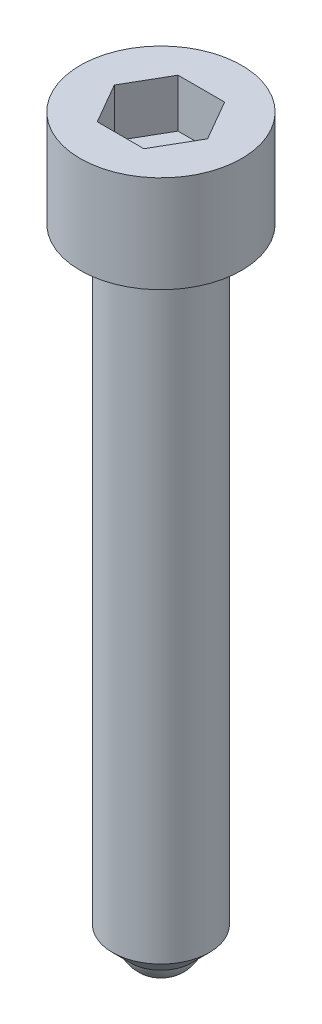
ISO-10303-21;
HEADER;
FILE_DESCRIPTION(('STEP AP214'),'2;1');
FILE_NAME('part.step','',(''),(''),'','','');
FILE_SCHEMA(('AUTOMOTIVE_DESIGN { 1 0 10303 214 1 1 1 1 }'));
ENDSEC;
DATA;
#1=APPLICATION_CONTEXT('core data for automotive mechanical design processes');
#2=APPLICATION_PROTOCOL_DEFINITION('international standard','automotive_design',2000,#1);
#3=PRODUCT_CONTEXT('',#1,'mechanical');
#4=PRODUCT('Part','Part','',(#3));
#5=PRODUCT_RELATED_PRODUCT_CATEGORY('part','',(#4));
#6=PRODUCT_DEFINITION_FORMATION('','',#4);
#7=PRODUCT_DEFINITION_CONTEXT('part definition',#1,'design');
#8=PRODUCT_DEFINITION('design','',#6,#7);
#9=PRODUCT_DEFINITION_SHAPE('','',#8);
#10=(LENGTH_UNIT() NAMED_UNIT(*) SI_UNIT(.MILLI.,.METRE.));
#11=(NAMED_UNIT(*) PLANE_ANGLE_UNIT() SI_UNIT($,.RADIAN.));
#12=(NAMED_UNIT(*) SI_UNIT($,.STERADIAN.) SOLID_ANGLE_UNIT());
#13=UNCERTAINTY_MEASURE_WITH_UNIT(LENGTH_MEASURE(1.E-05),#10,'distance_accuracy_value','');
#14=(GEOMETRIC_REPRESENTATION_CONTEXT(3) GLOBAL_UNCERTAINTY_ASSIGNED_CONTEXT((#13)) GLOBAL_UNIT_ASSIGNED_CONTEXT((#10,
#11,#12)) REPRESENTATION_CONTEXT('',''));
#15=CARTESIAN_POINT('',(0.,0.,0.));
#16=DIRECTION('',(0.,0.,1.));
#17=DIRECTION('',(1.,0.,0.));
#18=AXIS2_PLACEMENT_3D('',#15,#16,#17);
#19=CARTESIAN_POINT('',(0.,-38.,0.));
#20=DIRECTION('',(0.,1.,0.));
#21=DIRECTION('',(1.,0.,0.));
#22=AXIS2_PLACEMENT_3D('',#19,#20,#21);
#23=SPHERICAL_SURFACE('',#22,2.);
#24=CARTESIAN_POINT('',(0.,-38.7,0.));
#25=DIRECTION('',(0.,1.,0.));
#26=DIRECTION('',(0.,0.,1.));
#27=AXIS2_PLACEMENT_3D('',#24,#25,#26);
#28=CIRCLE('',#27,1.87349939951953);
#29=CARTESIAN_POINT('',(0.,-38.7,1.87349939951953));
#30=VERTEX_POINT('',#29);
#31=EDGE_CURVE('E11',#30,#30,#28,.T.);
#32=ORIENTED_EDGE('',*,*,#31,.F.);
#33=EDGE_LOOP('',(#32));
#34=FACE_BOUND('',#33,.T.);
#35=ADVANCED_FACE('F34',(#34),#23,.T.);
#36=CARTESIAN_POINT('',(0.,-38.7,0.));
#37=DIRECTION('',(0.,1.,0.));
#38=DIRECTION('',(0.,0.,1.));
#39=AXIS2_PLACEMENT_3D('',#36,#37,#38);
#40=CONICAL_SURFACE('',#39,1.87349939951953,0.785398163397446);
#41=CARTESIAN_POINT('',(0.,-37.5734993995195,0.));
#42=DIRECTION('',(0.,1.,0.));
#43=DIRECTION('',(0.,0.,1.));
#44=AXIS2_PLACEMENT_3D('',#41,#42,#43);
#45=CIRCLE('',#44,3.00000000000001);
#46=CARTESIAN_POINT('',(0.,-37.5734993995195,3.00000000000001));
#47=VERTEX_POINT('',#46);
#48=EDGE_CURVE('E41',#47,#47,#45,.T.);
#49=ORIENTED_EDGE('',*,*,#48,.F.);
#50=EDGE_LOOP('',(#49));
#51=FACE_BOUND('',#50,.T.);
#52=ORIENTED_EDGE('',*,*,#31,.T.);
#53=EDGE_LOOP('',(#52));
#54=FACE_BOUND('',#53,.T.);
#55=ADVANCED_FACE('F153',(#51,#54),#40,.T.);
#56=CARTESIAN_POINT('',(0.,61.6916426261037,0.));
#57=DIRECTION('',(0.,1.,0.));
#58=DIRECTION('',(0.,0.,1.));
#59=AXIS2_PLACEMENT_3D('',#56,#57,#58);
#60=CYLINDRICAL_SURFACE('',#59,3.00000000000001);
#61=CARTESIAN_POINT('',(0.,0.,0.));
#62=DIRECTION('',(0.,1.,0.));
#63=DIRECTION('',(0.,0.,1.));
#64=AXIS2_PLACEMENT_3D('',#61,#62,#63);
#65=CIRCLE('',#64,3.00000000000001);
#66=CARTESIAN_POINT('',(0.,0.,3.00000000000001));
#67=VERTEX_POINT('',#66);
#68=EDGE_CURVE('E146',#67,#67,#65,.T.);
#69=ORIENTED_EDGE('',*,*,#68,.F.);
#70=EDGE_LOOP('',(#69));
#71=FACE_BOUND('',#70,.T.);
#72=ORIENTED_EDGE('',*,*,#48,.T.);
#73=EDGE_LOOP('',(#72));
#74=FACE_BOUND('',#73,.T.);
#75=ADVANCED_FACE('F151',(#71,#74),#60,.T.);
#76=CARTESIAN_POINT('',(3.00000000000001,0.,0.));
#77=DIRECTION('',(0.,1.,0.));
#78=DIRECTION('',(0.,0.,1.));
#79=AXIS2_PLACEMENT_3D('',#76,#77,#78);
#80=PLANE('',#79);
#81=CARTESIAN_POINT('',(0.,0.,0.));
#82=DIRECTION('',(0.,1.,0.));
#83=DIRECTION('',(0.,0.,1.));
#84=AXIS2_PLACEMENT_3D('',#81,#82,#83);
#85=CIRCLE('',#84,5.00000000000001);
#86=CARTESIAN_POINT('',(0.,0.,5.00000000000001));
#87=VERTEX_POINT('',#86);
#88=EDGE_CURVE('E143',#87,#87,#85,.T.);
#89=ORIENTED_EDGE('',*,*,#88,.F.);
#90=EDGE_LOOP('',(#89));
#91=FACE_BOUND('',#90,.T.);
#92=ORIENTED_EDGE('',*,*,#68,.T.);
#93=EDGE_LOOP('',(#92));
#94=FACE_BOUND('',#93,.T.);
#95=ADVANCED_FACE('F171',(#91,#94),#80,.F.);
#96=CARTESIAN_POINT('',(0.,61.6916426261037,0.));
#97=DIRECTION('',(0.,1.,0.));
#98=DIRECTION('',(0.,0.,1.));
#99=AXIS2_PLACEMENT_3D('',#96,#97,#98);
#100=CYLINDRICAL_SURFACE('',#99,5.00000000000001);
#101=CARTESIAN_POINT('',(0.,6.,0.));
#102=DIRECTION('',(0.,1.,0.));
#103=DIRECTION('',(0.,0.,1.));
#104=AXIS2_PLACEMENT_3D('',#101,#102,#103);
#105=CIRCLE('',#104,5.00000000000001);
#106=CARTESIAN_POINT('',(0.,6.,5.00000000000001));
#107=VERTEX_POINT('',#106);
#108=EDGE_CURVE('E135',#107,#107,#105,.T.);
#109=ORIENTED_EDGE('',*,*,#108,.F.);
#110=EDGE_LOOP('',(#109));
#111=FACE_BOUND('',#110,.T.);
#112=ORIENTED_EDGE('',*,*,#88,.T.);
#113=EDGE_LOOP('',(#112));
#114=FACE_BOUND('',#113,.T.);
#115=ADVANCED_FACE('F179',(#111,#114),#100,.T.);
#116=CARTESIAN_POINT('',(5.00000000000001,6.,0.));
#117=DIRECTION('',(0.,-1.,0.));
#118=DIRECTION('',(0.,0.,-1.));
#119=AXIS2_PLACEMENT_3D('',#116,#117,#118);
#120=PLANE('',#119);
#121=DIRECTION('',(-1.,0.,0.));
#122=VECTOR('',#121,1.);
#123=CARTESIAN_POINT('',(1.44337567297406,6.,-2.5));
#124=LINE('',#123,#122);
#125=CARTESIAN_POINT('',(1.44337567297406,6.,-2.5));
#126=VERTEX_POINT('',#125);
#127=CARTESIAN_POINT('',(-1.44337567297406,6.,-2.5));
#128=VERTEX_POINT('',#127);
#129=EDGE_CURVE('E122',#126,#128,#124,.T.);
#130=ORIENTED_EDGE('',*,*,#129,.F.);
#131=DIRECTION('',(-0.5,0.,-0.866025403784439));
#132=VECTOR('',#131,1.);
#133=CARTESIAN_POINT('',(2.88675134594813,6.,0.));
#134=LINE('',#133,#132);
#135=CARTESIAN_POINT('',(2.88675134594813,6.,0.));
#136=VERTEX_POINT('',#135);
#137=EDGE_CURVE('E48',#136,#126,#134,.T.);
#138=ORIENTED_EDGE('',*,*,#137,.F.);
#139=DIRECTION('',(0.5,0.,-0.866025403784439));
#140=VECTOR('',#139,1.);
#141=CARTESIAN_POINT('',(1.44337567297407,6.,2.5));
#142=LINE('',#141,#140);
#143=CARTESIAN_POINT('',(1.44337567297407,6.,2.5));
#144=VERTEX_POINT('',#143);
#145=EDGE_CURVE('E131',#144,#136,#142,.T.);
#146=ORIENTED_EDGE('',*,*,#145,.F.);
#147=DIRECTION('',(1.,0.,0.));
#148=VECTOR('',#147,1.);
#149=CARTESIAN_POINT('',(-1.44337567297406,6.,2.5));
#150=LINE('',#149,#148);
#151=CARTESIAN_POINT('',(-1.44337567297406,6.,2.5));
#152=VERTEX_POINT('',#151);
#153=EDGE_CURVE('E129',#152,#144,#150,.T.);
#154=ORIENTED_EDGE('',*,*,#153,.F.);
#155=DIRECTION('',(0.5,0.,0.866025403784439));
#156=VECTOR('',#155,1.);
#157=CARTESIAN_POINT('',(-2.88675134594813,6.,0.));
#158=LINE('',#157,#156);
#159=CARTESIAN_POINT('',(-2.88675134594813,6.,0.));
#160=VERTEX_POINT('',#159);
#161=EDGE_CURVE('E96',#160,#152,#158,.T.);
#162=ORIENTED_EDGE('',*,*,#161,.F.);
#163=DIRECTION('',(-0.5,0.,0.866025403784439));
#164=VECTOR('',#163,1.);
#165=CARTESIAN_POINT('',(-1.44337567297406,6.,-2.5));
#166=LINE('',#165,#164);
#167=EDGE_CURVE('E125',#128,#160,#166,.T.);
#168=ORIENTED_EDGE('',*,*,#167,.F.);
#169=EDGE_LOOP('',(#130,#138,#146,#154,#162,#168));
#170=FACE_BOUND('',#169,.T.);
#171=ORIENTED_EDGE('',*,*,#108,.T.);
#172=EDGE_LOOP('',(#171));
#173=FACE_BOUND('',#172,.T.);
#174=ADVANCED_FACE('F187',(#170,#173),#120,.F.);
#175=CARTESIAN_POINT('',(2.88675134594813,3.,0.));
#176=DIRECTION('',(0.866025403784438,0.,-0.5));
#177=DIRECTION('',(-0.5,0.,-0.866025403784439));
#178=AXIS2_PLACEMENT_3D('',#175,#176,#177);
#179=PLANE('',#178);
#180=ORIENTED_EDGE('',*,*,#137,.T.);
#181=DIRECTION('',(0.,1.,0.));
#182=VECTOR('',#181,1.);
#183=CARTESIAN_POINT('',(1.44337567297406,3.,-2.5));
#184=LINE('',#183,#182);
#185=CARTESIAN_POINT('',(1.44337567297406,3.,-2.5));
#186=VERTEX_POINT('',#185);
#187=EDGE_CURVE('E78',#186,#126,#184,.T.);
#188=ORIENTED_EDGE('',*,*,#187,.F.);
#189=DIRECTION('',(-0.5,0.,-0.866025403784439));
#190=VECTOR('',#189,1.);
#191=CARTESIAN_POINT('',(2.88675134594813,3.,0.));
#192=LINE('',#191,#190);
#193=CARTESIAN_POINT('',(2.88675134594813,3.,0.));
#194=VERTEX_POINT('',#193);
#195=EDGE_CURVE('E133',#194,#186,#192,.T.);
#196=ORIENTED_EDGE('',*,*,#195,.F.);
#197=DIRECTION('',(0.,1.,0.));
#198=VECTOR('',#197,1.);
#199=CARTESIAN_POINT('',(2.88675134594813,3.,0.));
#200=LINE('',#199,#198);
#201=EDGE_CURVE('E56',#194,#136,#200,.T.);
#202=ORIENTED_EDGE('',*,*,#201,.T.);
#203=EDGE_LOOP('',(#180,#188,#196,#202));
#204=FACE_BOUND('',#203,.T.);
#205=ADVANCED_FACE('F195',(#204),#179,.F.);
#206=CARTESIAN_POINT('',(1.44337567297407,3.,2.5));
#207=DIRECTION('',(0.866025403784438,0.,0.5));
#208=DIRECTION('',(0.5,0.,-0.866025403784439));
#209=AXIS2_PLACEMENT_3D('',#206,#207,#208);
#210=PLANE('',#209);
#211=ORIENTED_EDGE('',*,*,#145,.T.);
#212=ORIENTED_EDGE('',*,*,#201,.F.);
#213=DIRECTION('',(0.5,0.,-0.866025403784439));
#214=VECTOR('',#213,1.);
#215=CARTESIAN_POINT('',(1.44337567297407,3.,2.5));
#216=LINE('',#215,#214);
#217=CARTESIAN_POINT('',(1.44337567297407,3.,2.5));
#218=VERTEX_POINT('',#217);
#219=EDGE_CURVE('E108',#218,#194,#216,.T.);
#220=ORIENTED_EDGE('',*,*,#219,.F.);
#221=DIRECTION('',(0.,1.,0.));
#222=VECTOR('',#221,1.);
#223=CARTESIAN_POINT('',(1.44337567297407,3.,2.5));
#224=LINE('',#223,#222);
#225=EDGE_CURVE('E100',#218,#144,#224,.T.);
#226=ORIENTED_EDGE('',*,*,#225,.T.);
#227=EDGE_LOOP('',(#211,#212,#220,#226));
#228=FACE_BOUND('',#227,.T.);
#229=ADVANCED_FACE('F203',(#228),#210,.F.);
#230=CARTESIAN_POINT('',(-1.44337567297406,3.,2.5));
#231=DIRECTION('',(0.,0.,1.));
#232=DIRECTION('',(1.,0.,0.));
#233=AXIS2_PLACEMENT_3D('',#230,#231,#232);
#234=PLANE('',#233);
#235=ORIENTED_EDGE('',*,*,#153,.T.);
#236=ORIENTED_EDGE('',*,*,#225,.F.);
#237=DIRECTION('',(1.,0.,0.));
#238=VECTOR('',#237,1.);
#239=CARTESIAN_POINT('',(-1.44337567297406,3.,2.5));
#240=LINE('',#239,#238);
#241=CARTESIAN_POINT('',(-1.44337567297406,3.,2.5));
#242=VERTEX_POINT('',#241);
#243=EDGE_CURVE('E104',#242,#218,#240,.T.);
#244=ORIENTED_EDGE('',*,*,#243,.F.);
#245=DIRECTION('',(0.,1.,0.));
#246=VECTOR('',#245,1.);
#247=CARTESIAN_POINT('',(-1.44337567297406,3.,2.5));
#248=LINE('',#247,#246);
#249=EDGE_CURVE('E89',#242,#152,#248,.T.);
#250=ORIENTED_EDGE('',*,*,#249,.T.);
#251=EDGE_LOOP('',(#235,#236,#244,#250));
#252=FACE_BOUND('',#251,.T.);
#253=ADVANCED_FACE('F105',(#252),#234,.F.);
#254=CARTESIAN_POINT('',(-2.88675134594813,3.,0.));
#255=DIRECTION('',(-0.866025403784438,0.,0.5));
#256=DIRECTION('',(0.5,0.,0.866025403784439));
#257=AXIS2_PLACEMENT_3D('',#254,#255,#256);
#258=PLANE('',#257);
#259=ORIENTED_EDGE('',*,*,#161,.T.);
#260=ORIENTED_EDGE('',*,*,#249,.F.);
#261=DIRECTION('',(0.5,0.,0.866025403784439));
#262=VECTOR('',#261,1.);
#263=CARTESIAN_POINT('',(-2.88675134594813,3.,0.));
#264=LINE('',#263,#262);
#265=CARTESIAN_POINT('',(-2.88675134594813,3.,0.));
#266=VERTEX_POINT('',#265);
#267=EDGE_CURVE('E93',#266,#242,#264,.T.);
#268=ORIENTED_EDGE('',*,*,#267,.F.);
#269=DIRECTION('',(0.,1.,0.));
#270=VECTOR('',#269,1.);
#271=CARTESIAN_POINT('',(-2.88675134594813,3.,0.));
#272=LINE('',#271,#270);
#273=EDGE_CURVE('E101',#266,#160,#272,.T.);
#274=ORIENTED_EDGE('',*,*,#273,.T.);
#275=EDGE_LOOP('',(#259,#260,#268,#274));
#276=FACE_BOUND('',#275,.T.);
#277=ADVANCED_FACE('F91',(#276),#258,.F.);
#278=CARTESIAN_POINT('',(-1.44337567297406,3.,-2.5));
#279=DIRECTION('',(-0.866025403784439,0.,-0.5));
#280=DIRECTION('',(-0.5,0.,0.866025403784439));
#281=AXIS2_PLACEMENT_3D('',#278,#279,#280);
#282=PLANE('',#281);
#283=ORIENTED_EDGE('',*,*,#167,.T.);
#284=ORIENTED_EDGE('',*,*,#273,.F.);
#285=DIRECTION('',(-0.5,0.,0.866025403784439));
#286=VECTOR('',#285,1.);
#287=CARTESIAN_POINT('',(-1.44337567297406,3.,-2.5));
#288=LINE('',#287,#286);
#289=CARTESIAN_POINT('',(-1.44337567297406,3.,-2.5));
#290=VERTEX_POINT('',#289);
#291=EDGE_CURVE('E114',#290,#266,#288,.T.);
#292=ORIENTED_EDGE('',*,*,#291,.F.);
#293=DIRECTION('',(0.,1.,0.));
#294=VECTOR('',#293,1.);
#295=CARTESIAN_POINT('',(-1.44337567297406,3.,-2.5));
#296=LINE('',#295,#294);
#297=EDGE_CURVE('E138',#290,#128,#296,.T.);
#298=ORIENTED_EDGE('',*,*,#297,.T.);
#299=EDGE_LOOP('',(#283,#284,#292,#298));
#300=FACE_BOUND('',#299,.T.);
#301=ADVANCED_FACE('F222',(#300),#282,.F.);
#302=CARTESIAN_POINT('',(1.44337567297406,3.,-2.5));
#303=DIRECTION('',(0.,0.,-1.));
#304=DIRECTION('',(-1.,0.,0.));
#305=AXIS2_PLACEMENT_3D('',#302,#303,#304);
#306=PLANE('',#305);
#307=ORIENTED_EDGE('',*,*,#129,.T.);
#308=ORIENTED_EDGE('',*,*,#297,.F.);
#309=DIRECTION('',(-1.,0.,0.));
#310=VECTOR('',#309,1.);
#311=CARTESIAN_POINT('',(1.44337567297406,3.,-2.5));
#312=LINE('',#311,#310);
#313=EDGE_CURVE('E116',#186,#290,#312,.T.);
#314=ORIENTED_EDGE('',*,*,#313,.F.);
#315=ORIENTED_EDGE('',*,*,#187,.T.);
#316=EDGE_LOOP('',(#307,#308,#314,#315));
#317=FACE_BOUND('',#316,.T.);
#318=ADVANCED_FACE('F229',(#317),#306,.F.);
#319=CARTESIAN_POINT('',(2.88675134594813,3.,0.));
#320=DIRECTION('',(0.,-1.,0.));
#321=DIRECTION('',(0.,0.,-1.));
#322=AXIS2_PLACEMENT_3D('',#319,#320,#321);
#323=PLANE('',#322);
#324=ORIENTED_EDGE('',*,*,#195,.T.);
#325=ORIENTED_EDGE('',*,*,#313,.T.);
#326=ORIENTED_EDGE('',*,*,#291,.T.);
#327=ORIENTED_EDGE('',*,*,#267,.T.);
#328=ORIENTED_EDGE('',*,*,#243,.T.);
#329=ORIENTED_EDGE('',*,*,#219,.T.);
#330=EDGE_LOOP('',(#324,#325,#326,#327,#328,#329));
#331=FACE_BOUND('',#330,.T.);
#332=ADVANCED_FACE('F111',(#331),#323,.F.);
#333=CLOSED_SHELL('',(#35,#55,#75,#95,#115,#174,#205,#229,#253,#277,#301,#318,#332));
#334=MANIFOLD_SOLID_BREP('B2',#333);
#335=ADVANCED_BREP_SHAPE_REPRESENTATION('',(#18,#334),#14);
#336=SHAPE_DEFINITION_REPRESENTATION(#9,#335);
ENDSEC;
END-ISO-10303-21;
